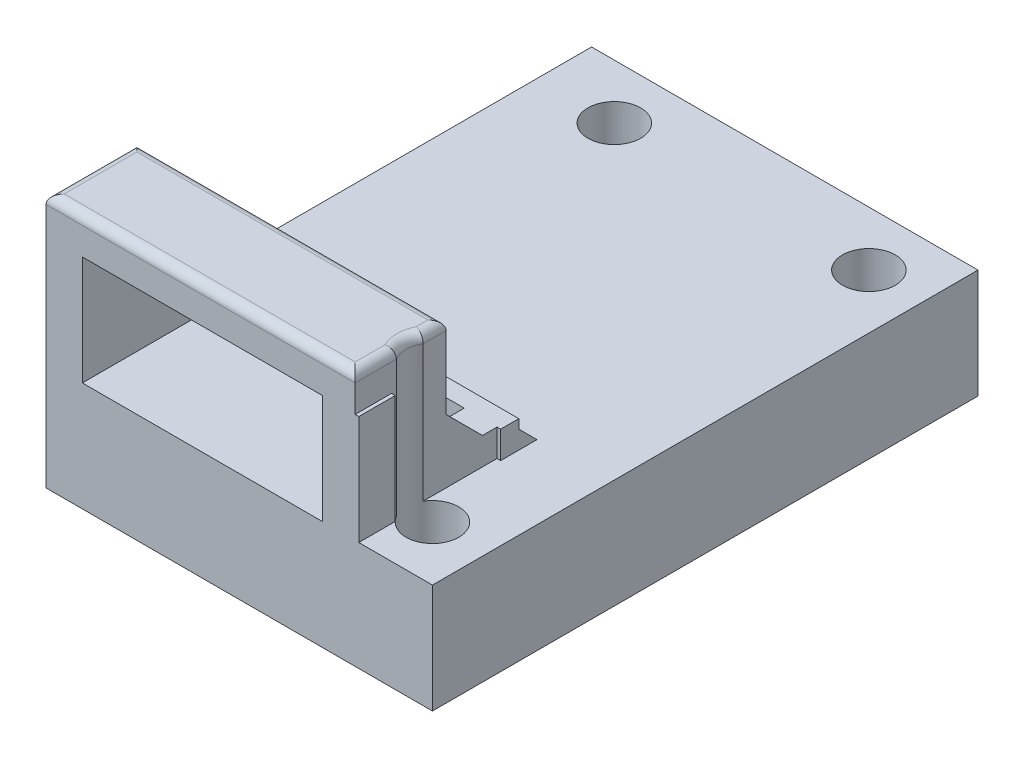
ISO-10303-21;
HEADER;
FILE_DESCRIPTION(('STEP AP214'),'2;1');
FILE_NAME('part.step','',(''),(''),'','','');
FILE_SCHEMA(('AUTOMOTIVE_DESIGN { 1 0 10303 214 1 1 1 1 }'));
ENDSEC;
DATA;
#1=APPLICATION_CONTEXT('core data for automotive mechanical design processes');
#2=APPLICATION_PROTOCOL_DEFINITION('international standard','automotive_design',2000,#1);
#3=PRODUCT_CONTEXT('',#1,'mechanical');
#4=PRODUCT('Part','Part','',(#3));
#5=PRODUCT_RELATED_PRODUCT_CATEGORY('part','',(#4));
#6=PRODUCT_DEFINITION_FORMATION('','',#4);
#7=PRODUCT_DEFINITION_CONTEXT('part definition',#1,'design');
#8=PRODUCT_DEFINITION('design','',#6,#7);
#9=PRODUCT_DEFINITION_SHAPE('','',#8);
#10=(LENGTH_UNIT() NAMED_UNIT(*) SI_UNIT(.MILLI.,.METRE.));
#11=(NAMED_UNIT(*) PLANE_ANGLE_UNIT() SI_UNIT($,.RADIAN.));
#12=(NAMED_UNIT(*) SI_UNIT($,.STERADIAN.) SOLID_ANGLE_UNIT());
#13=UNCERTAINTY_MEASURE_WITH_UNIT(LENGTH_MEASURE(1.E-05),#10,'distance_accuracy_value','');
#14=(GEOMETRIC_REPRESENTATION_CONTEXT(3) GLOBAL_UNCERTAINTY_ASSIGNED_CONTEXT((#13)) GLOBAL_UNIT_ASSIGNED_CONTEXT((#10,
#11,#12)) REPRESENTATION_CONTEXT('',''));
#15=CARTESIAN_POINT('',(0.,0.,0.));
#16=DIRECTION('',(0.,0.,1.));
#17=DIRECTION('',(1.,0.,0.));
#18=AXIS2_PLACEMENT_3D('',#15,#16,#17);
#19=CARTESIAN_POINT('',(-21.25,10.,-2.79999999999999));
#20=DIRECTION('',(0.,0.,-1.));
#21=DIRECTION('',(-1.,0.,0.));
#22=AXIS2_PLACEMENT_3D('',#19,#20,#21);
#23=PLANE('',#22);
#24=DIRECTION('',(0.,-1.,0.));
#25=VECTOR('',#24,1.);
#26=CARTESIAN_POINT('',(-6.05,5.5,-2.79999999999999));
#27=LINE('',#26,#25);
#28=CARTESIAN_POINT('',(-6.05,5.5,-2.79999999999999));
#29=VERTEX_POINT('',#28);
#30=CARTESIAN_POINT('',(-6.05,4.,-2.79999999999999));
#31=VERTEX_POINT('',#30);
#32=EDGE_CURVE('E298',#29,#31,#27,.T.);
#33=ORIENTED_EDGE('',*,*,#32,.F.);
#34=DIRECTION('',(1.,0.,0.));
#35=VECTOR('',#34,1.);
#36=CARTESIAN_POINT('',(-18.75,5.5,-2.79999999999999));
#37=LINE('',#36,#35);
#38=CARTESIAN_POINT('',(-19.25,5.5,-2.79999999999999));
#39=VERTEX_POINT('',#38);
#40=EDGE_CURVE('E316',#39,#29,#37,.T.);
#41=ORIENTED_EDGE('',*,*,#40,.F.);
#42=DIRECTION('',(0.,-1.,0.));
#43=VECTOR('',#42,1.);
#44=CARTESIAN_POINT('',(-19.25,5.5,-2.79999999999999));
#45=LINE('',#44,#43);
#46=CARTESIAN_POINT('',(-19.25,4.,-2.79999999999999));
#47=VERTEX_POINT('',#46);
#48=EDGE_CURVE('E313',#39,#47,#45,.T.);
#49=ORIENTED_EDGE('',*,*,#48,.T.);
#50=DIRECTION('',(1.,0.,0.));
#51=VECTOR('',#50,1.);
#52=CARTESIAN_POINT('',(-21.25,4.,-2.79999999999999));
#53=LINE('',#52,#51);
#54=EDGE_CURVE('E328',#47,#31,#53,.T.);
#55=ORIENTED_EDGE('',*,*,#54,.T.);
#56=EDGE_LOOP('',(#33,#41,#49,#55));
#57=FACE_BOUND('',#56,.T.);
#58=ADVANCED_FACE('F37',(#57),#23,.F.);
#59=DIRECTION('',(-1.,0.,0.));
#60=VECTOR('',#59,1.);
#61=CARTESIAN_POINT('',(-6.55,5.5,-2.79999999999999));
#62=LINE('',#61,#60);
#63=CARTESIAN_POINT('',(-4.05000000000001,5.5,-2.79999999999999));
#64=VERTEX_POINT('',#63);
#65=CARTESIAN_POINT('',(-4.24999999999999,5.5,-2.79999999999999));
#66=VERTEX_POINT('',#65);
#67=EDGE_CURVE('E261',#64,#66,#62,.T.);
#68=ORIENTED_EDGE('',*,*,#67,.T.);
#69=DIRECTION('',(0.,-1.,0.));
#70=VECTOR('',#69,1.);
#71=CARTESIAN_POINT('',(-4.24999999999999,5.5,-2.79999999999999));
#72=LINE('',#71,#70);
#73=CARTESIAN_POINT('',(-4.24999999999999,4.,-2.79999999999999));
#74=VERTEX_POINT('',#73);
#75=EDGE_CURVE('E303',#66,#74,#72,.T.);
#76=ORIENTED_EDGE('',*,*,#75,.T.);
#77=CARTESIAN_POINT('',(-4.05000000000001,4.,-2.79999999999999));
#78=VERTEX_POINT('',#77);
#79=EDGE_CURVE('E327',#74,#78,#53,.T.);
#80=ORIENTED_EDGE('',*,*,#79,.T.);
#81=DIRECTION('',(0.,-1.,0.));
#82=VECTOR('',#81,1.);
#83=CARTESIAN_POINT('',(-4.05000000000001,10.,-2.79999999999999));
#84=LINE('',#83,#82);
#85=EDGE_CURVE('E323',#64,#78,#84,.T.);
#86=ORIENTED_EDGE('',*,*,#85,.F.);
#87=EDGE_LOOP('',(#68,#76,#80,#86));
#88=FACE_BOUND('',#87,.T.);
#89=ADVANCED_FACE('F484',(#88),#23,.F.);
#90=CARTESIAN_POINT('',(-21.25,4.,0.));
#91=DIRECTION('',(1.,0.,0.));
#92=DIRECTION('',(0.,0.,-1.));
#93=AXIS2_PLACEMENT_3D('',#90,#91,#92);
#94=PLANE('',#93);
#95=DIRECTION('',(0.,-1.,0.));
#96=VECTOR('',#95,1.);
#97=CARTESIAN_POINT('',(-21.25,4.,5.00000000000001));
#98=LINE('',#97,#96);
#99=CARTESIAN_POINT('',(-21.25,11.5,5.00000000000001));
#100=VERTEX_POINT('',#99);
#101=CARTESIAN_POINT('',(-21.25,-2.,5.00000000000001));
#102=VERTEX_POINT('',#101);
#103=EDGE_CURVE('E386',#100,#102,#98,.T.);
#104=ORIENTED_EDGE('',*,*,#103,.F.);
#105=DIRECTION('',(0.,0.,1.));
#106=VECTOR('',#105,1.);
#107=CARTESIAN_POINT('',(-21.25,11.5,0.));
#108=LINE('',#107,#106);
#109=CARTESIAN_POINT('',(-21.25,11.5,0.));
#110=VERTEX_POINT('',#109);
#111=EDGE_CURVE('E434',#100,#110,#108,.F.);
#112=ORIENTED_EDGE('',*,*,#111,.T.);
#113=DIRECTION('',(0.,-1.,0.));
#114=VECTOR('',#113,1.);
#115=CARTESIAN_POINT('',(-21.25,12.,0.));
#116=LINE('',#115,#114);
#117=CARTESIAN_POINT('',(-21.25,7.50000000000002,0.));
#118=VERTEX_POINT('',#117);
#119=EDGE_CURVE('E281',#110,#118,#116,.T.);
#120=ORIENTED_EDGE('',*,*,#119,.T.);
#121=DIRECTION('',(0.,-0.707106781186551,-0.707106781186544));
#122=VECTOR('',#121,1.);
#123=CARTESIAN_POINT('',(-21.25,5.74999999999999,-1.75));
#124=LINE('',#123,#122);
#125=CARTESIAN_POINT('',(-21.25,5.5,-2.));
#126=VERTEX_POINT('',#125);
#127=EDGE_CURVE('E409',#118,#126,#124,.T.);
#128=ORIENTED_EDGE('',*,*,#127,.T.);
#129=DIRECTION('',(0.,0.,1.));
#130=VECTOR('',#129,1.);
#131=CARTESIAN_POINT('',(-21.25,5.5,3.00000000000001));
#132=LINE('',#131,#130);
#133=CARTESIAN_POINT('',(-21.25,5.5,-3.79999999999999));
#134=VERTEX_POINT('',#133);
#135=EDGE_CURVE('E310',#134,#126,#132,.T.);
#136=ORIENTED_EDGE('',*,*,#135,.F.);
#137=DIRECTION('',(0.,-1.,0.));
#138=VECTOR('',#137,1.);
#139=CARTESIAN_POINT('',(-21.25,10.,-3.79999999999999));
#140=LINE('',#139,#138);
#141=CARTESIAN_POINT('',(-21.25,5.00000000000001,-3.79999999999999));
#142=VERTEX_POINT('',#141);
#143=EDGE_CURVE('E331',#134,#142,#140,.T.);
#144=ORIENTED_EDGE('',*,*,#143,.T.);
#145=DIRECTION('',(0.,-0.707106781186551,-0.707106781186544));
#146=VECTOR('',#145,1.);
#147=CARTESIAN_POINT('',(-21.25,6.4,-2.40000000000002));
#148=LINE('',#147,#146);
#149=CARTESIAN_POINT('',(-21.25,4.,-4.79999999999999));
#150=VERTEX_POINT('',#149);
#151=EDGE_CURVE('E394',#142,#150,#148,.T.);
#152=ORIENTED_EDGE('',*,*,#151,.T.);
#153=DIRECTION('',(0.,0.,1.));
#154=VECTOR('',#153,1.);
#155=CARTESIAN_POINT('',(-21.25,4.,0.));
#156=LINE('',#155,#154);
#157=CARTESIAN_POINT('',(-21.25,4.,-25.));
#158=VERTEX_POINT('',#157);
#159=EDGE_CURVE('E379',#158,#150,#156,.T.);
#160=ORIENTED_EDGE('',*,*,#159,.F.);
#161=DIRECTION('',(0.,1.,0.));
#162=VECTOR('',#161,1.);
#163=CARTESIAN_POINT('',(-21.25,4.,-25.));
#164=LINE('',#163,#162);
#165=CARTESIAN_POINT('',(-21.25,-2.,-25.));
#166=VERTEX_POINT('',#165);
#167=EDGE_CURVE('E234',#166,#158,#164,.T.);
#168=ORIENTED_EDGE('',*,*,#167,.F.);
#169=DIRECTION('',(0.,0.,-1.));
#170=VECTOR('',#169,1.);
#171=CARTESIAN_POINT('',(-21.25,-2.,5.00000000000001));
#172=LINE('',#171,#170);
#173=EDGE_CURVE('E251',#102,#166,#172,.T.);
#174=ORIENTED_EDGE('',*,*,#173,.F.);
#175=EDGE_LOOP('',(#104,#112,#120,#128,#136,#144,#152,#160,#168,#174));
#176=FACE_BOUND('',#175,.T.);
#177=ADVANCED_FACE('F490',(#176),#94,.F.);
#178=CARTESIAN_POINT('',(-21.25,10.,-3.79999999999999));
#179=DIRECTION('',(0.,0.,1.));
#180=DIRECTION('',(1.,0.,0.));
#181=AXIS2_PLACEMENT_3D('',#178,#179,#180);
#182=PLANE('',#181);
#183=DIRECTION('',(-1.,0.,0.));
#184=VECTOR('',#183,1.);
#185=CARTESIAN_POINT('',(-18.75,5.5,-3.79999999999999));
#186=LINE('',#185,#184);
#187=CARTESIAN_POINT('',(-4.05,5.5,-3.79999999999999));
#188=VERTEX_POINT('',#187);
#189=EDGE_CURVE('E318',#188,#134,#186,.T.);
#190=ORIENTED_EDGE('',*,*,#189,.F.);
#191=DIRECTION('',(0.,-1.,0.));
#192=VECTOR('',#191,1.);
#193=CARTESIAN_POINT('',(-4.05,10.,-3.79999999999999));
#194=LINE('',#193,#192);
#195=CARTESIAN_POINT('',(-4.05,5.00000000000001,-3.79999999999999));
#196=VERTEX_POINT('',#195);
#197=EDGE_CURVE('E325',#188,#196,#194,.T.);
#198=ORIENTED_EDGE('',*,*,#197,.T.);
#199=DIRECTION('',(-1.,0.,0.));
#200=VECTOR('',#199,1.);
#201=CARTESIAN_POINT('',(-21.25,5.00000000000001,-3.79999999999999));
#202=LINE('',#201,#200);
#203=EDGE_CURVE('E388',#196,#142,#202,.T.);
#204=ORIENTED_EDGE('',*,*,#203,.T.);
#205=ORIENTED_EDGE('',*,*,#143,.F.);
#206=EDGE_LOOP('',(#190,#198,#204,#205));
#207=FACE_BOUND('',#206,.T.);
#208=ADVANCED_FACE('F495',(#207),#182,.F.);
#209=CARTESIAN_POINT('',(-4.05,10.,-3.79999999999999));
#210=DIRECTION('',(-1.,0.,0.));
#211=DIRECTION('',(0.,0.,1.));
#212=AXIS2_PLACEMENT_3D('',#209,#210,#211);
#213=PLANE('',#212);
#214=DIRECTION('',(0.,0.,1.));
#215=VECTOR('',#214,1.);
#216=CARTESIAN_POINT('',(-4.05000000000001,5.5,-2.79999999999999));
#217=LINE('',#216,#215);
#218=EDGE_CURVE('E264',#188,#64,#217,.T.);
#219=ORIENTED_EDGE('',*,*,#218,.T.);
#220=ORIENTED_EDGE('',*,*,#85,.T.);
#221=DIRECTION('',(0.,0.,-1.));
#222=VECTOR('',#221,1.);
#223=CARTESIAN_POINT('',(-4.05,4.,-3.79999999999999));
#224=LINE('',#223,#222);
#225=CARTESIAN_POINT('',(-4.05,4.,-4.79999999999999));
#226=VERTEX_POINT('',#225);
#227=EDGE_CURVE('E321',#78,#226,#224,.T.);
#228=ORIENTED_EDGE('',*,*,#227,.T.);
#229=DIRECTION('',(0.,0.707106781186551,0.707106781186544));
#230=VECTOR('',#229,1.);
#231=CARTESIAN_POINT('',(-4.05000000000001,7.50000000000003,-1.29999999999999));
#232=LINE('',#231,#230);
#233=EDGE_CURVE('E396',#226,#196,#232,.T.);
#234=ORIENTED_EDGE('',*,*,#233,.T.);
#235=ORIENTED_EDGE('',*,*,#197,.F.);
#236=EDGE_LOOP('',(#219,#220,#228,#234,#235));
#237=FACE_BOUND('',#236,.T.);
#238=ADVANCED_FACE('F655',(#237),#213,.F.);
#239=CARTESIAN_POINT('',(-4.24999999999999,5.5,3.00000000000001));
#240=DIRECTION('',(-1.,0.,0.));
#241=DIRECTION('',(0.,0.,1.));
#242=AXIS2_PLACEMENT_3D('',#239,#240,#241);
#243=PLANE('',#242);
#244=DIRECTION('',(0.,1.,0.));
#245=VECTOR('',#244,1.);
#246=CARTESIAN_POINT('',(-4.24999999999999,-4.5,2.73484692283497));
#247=LINE('',#246,#245);
#248=CARTESIAN_POINT('',(-4.24999999999999,4.,2.73484692283497));
#249=VERTEX_POINT('',#248);
#250=CARTESIAN_POINT('',(-4.24999999999999,11.5,2.73484692283497));
#251=VERTEX_POINT('',#250);
#252=EDGE_CURVE('E289',#249,#251,#247,.T.);
#253=ORIENTED_EDGE('',*,*,#252,.T.);
#254=DIRECTION('',(0.,0.,-1.));
#255=VECTOR('',#254,1.);
#256=CARTESIAN_POINT('',(-4.24999999999999,11.5,3.00000000000001));
#257=LINE('',#256,#255);
#258=CARTESIAN_POINT('',(-4.24999999999999,11.5,5.00000000000001));
#259=VERTEX_POINT('',#258);
#260=EDGE_CURVE('E12',#251,#259,#257,.F.);
#261=ORIENTED_EDGE('',*,*,#260,.T.);
#262=DIRECTION('',(0.,-1.,0.));
#263=VECTOR('',#262,1.);
#264=CARTESIAN_POINT('',(-4.24999999999999,12.,5.00000000000001));
#265=LINE('',#264,#263);
#266=CARTESIAN_POINT('',(-4.24999999999999,10.,5.00000000000001));
#267=VERTEX_POINT('',#266);
#268=EDGE_CURVE('E285',#259,#267,#265,.T.);
#269=ORIENTED_EDGE('',*,*,#268,.T.);
#270=DIRECTION('',(0.,0.,-1.));
#271=VECTOR('',#270,1.);
#272=CARTESIAN_POINT('',(-4.24999999999999,10.,5.00000000000001));
#273=LINE('',#272,#271);
#274=CARTESIAN_POINT('',(-4.24999999999999,10.,3.00000000000001));
#275=VERTEX_POINT('',#274);
#276=EDGE_CURVE('E276',#267,#275,#273,.T.);
#277=ORIENTED_EDGE('',*,*,#276,.T.);
#278=DIRECTION('',(0.,-1.,0.));
#279=VECTOR('',#278,1.);
#280=CARTESIAN_POINT('',(-4.24999999999999,5.5,3.00000000000001));
#281=LINE('',#280,#279);
#282=CARTESIAN_POINT('',(-4.24999999999999,4.,3.00000000000001));
#283=VERTEX_POINT('',#282);
#284=EDGE_CURVE('E305',#275,#283,#281,.T.);
#285=ORIENTED_EDGE('',*,*,#284,.T.);
#286=DIRECTION('',(0.,0.,-1.));
#287=VECTOR('',#286,1.);
#288=CARTESIAN_POINT('',(-4.24999999999999,4.,3.00000000000001));
#289=LINE('',#288,#287);
#290=EDGE_CURVE('E296',#283,#249,#289,.T.);
#291=ORIENTED_EDGE('',*,*,#290,.T.);
#292=EDGE_LOOP('',(#253,#261,#269,#277,#285,#291));
#293=FACE_BOUND('',#292,.T.);
#294=ADVANCED_FACE('F600',(#293),#243,.F.);
#295=CARTESIAN_POINT('',(0.,10.,0.));
#296=DIRECTION('',(0.,-1.,0.));
#297=DIRECTION('',(0.,0.,-1.));
#298=AXIS2_PLACEMENT_3D('',#295,#296,#297);
#299=PLANE('',#298);
#300=DIRECTION('',(-1.,0.,0.));
#301=VECTOR('',#300,1.);
#302=CARTESIAN_POINT('',(-21.25,10.,0.));
#303=LINE('',#302,#301);
#304=CARTESIAN_POINT('',(-6.05,10.,0.));
#305=VERTEX_POINT('',#304);
#306=CARTESIAN_POINT('',(-19.25,10.,0.));
#307=VERTEX_POINT('',#306);
#308=EDGE_CURVE('E279',#305,#307,#303,.T.);
#309=ORIENTED_EDGE('',*,*,#308,.F.);
#310=DIRECTION('',(0.,0.,1.));
#311=VECTOR('',#310,1.);
#312=CARTESIAN_POINT('',(-6.05,10.,3.00000000000001));
#313=LINE('',#312,#311);
#314=CARTESIAN_POINT('',(-6.05,10.,5.00000000000001));
#315=VERTEX_POINT('',#314);
#316=EDGE_CURVE('E334',#305,#315,#313,.T.);
#317=ORIENTED_EDGE('',*,*,#316,.T.);
#318=DIRECTION('',(1.,0.,0.));
#319=VECTOR('',#318,1.);
#320=CARTESIAN_POINT('',(-21.25,10.,5.00000000000001));
#321=LINE('',#320,#319);
#322=CARTESIAN_POINT('',(-19.25,10.,5.00000000000001));
#323=VERTEX_POINT('',#322);
#324=EDGE_CURVE('E273',#323,#315,#321,.T.);
#325=ORIENTED_EDGE('',*,*,#324,.F.);
#326=DIRECTION('',(0.,0.,-1.));
#327=VECTOR('',#326,1.);
#328=CARTESIAN_POINT('',(-19.25,10.,5.00000000000001));
#329=LINE('',#328,#327);
#330=EDGE_CURVE('E358',#323,#307,#329,.T.);
#331=ORIENTED_EDGE('',*,*,#330,.T.);
#332=EDGE_LOOP('',(#309,#317,#325,#331));
#333=FACE_BOUND('',#332,.T.);
#334=ADVANCED_FACE('F505',(#333),#299,.T.);
#335=CARTESIAN_POINT('',(-6.05,10.,3.00000000000001));
#336=DIRECTION('',(0.,0.,1.));
#337=DIRECTION('',(1.,0.,0.));
#338=AXIS2_PLACEMENT_3D('',#335,#336,#337);
#339=PLANE('',#338);
#340=ORIENTED_EDGE('',*,*,#284,.F.);
#341=DIRECTION('',(-1.,0.,0.));
#342=VECTOR('',#341,1.);
#343=CARTESIAN_POINT('',(-6.05,10.,3.00000000000001));
#344=LINE('',#343,#342);
#345=CARTESIAN_POINT('',(-4.05,10.,3.00000000000001));
#346=VERTEX_POINT('',#345);
#347=EDGE_CURVE('E341',#346,#275,#344,.T.);
#348=ORIENTED_EDGE('',*,*,#347,.F.);
#349=DIRECTION('',(0.,-1.,0.));
#350=VECTOR('',#349,1.);
#351=CARTESIAN_POINT('',(-4.05,10.,3.00000000000001));
#352=LINE('',#351,#350);
#353=CARTESIAN_POINT('',(-4.05,4.,3.00000000000001));
#354=VERTEX_POINT('',#353);
#355=EDGE_CURVE('E344',#346,#354,#352,.T.);
#356=ORIENTED_EDGE('',*,*,#355,.T.);
#357=DIRECTION('',(-1.,0.,0.));
#358=VECTOR('',#357,1.);
#359=CARTESIAN_POINT('',(-6.05,4.,3.00000000000001));
#360=LINE('',#359,#358);
#361=EDGE_CURVE('E337',#354,#283,#360,.T.);
#362=ORIENTED_EDGE('',*,*,#361,.T.);
#363=EDGE_LOOP('',(#340,#348,#356,#362));
#364=FACE_BOUND('',#363,.T.);
#365=ADVANCED_FACE('F501',(#364),#339,.F.);
#366=CARTESIAN_POINT('',(0.,10.,0.));
#367=DIRECTION('',(0.,1.,0.));
#368=DIRECTION('',(0.,0.,1.));
#369=AXIS2_PLACEMENT_3D('',#366,#367,#368);
#370=PLANE('',#369);
#371=ORIENTED_EDGE('',*,*,#347,.T.);
#372=ORIENTED_EDGE('',*,*,#276,.F.);
#373=DIRECTION('',(1.,0.,0.));
#374=VECTOR('',#373,1.);
#375=CARTESIAN_POINT('',(-6.05,10.,5.00000000000001));
#376=LINE('',#375,#374);
#377=CARTESIAN_POINT('',(-4.05000000000001,10.,5.00000000000001));
#378=VERTEX_POINT('',#377);
#379=EDGE_CURVE('E336',#267,#378,#376,.T.);
#380=ORIENTED_EDGE('',*,*,#379,.T.);
#381=DIRECTION('',(0.,0.,-1.));
#382=VECTOR('',#381,1.);
#383=CARTESIAN_POINT('',(-4.05,10.,3.00000000000001));
#384=LINE('',#383,#382);
#385=EDGE_CURVE('E339',#378,#346,#384,.T.);
#386=ORIENTED_EDGE('',*,*,#385,.T.);
#387=EDGE_LOOP('',(#371,#372,#380,#386));
#388=FACE_BOUND('',#387,.T.);
#389=ADVANCED_FACE('F497',(#388),#370,.T.);
#390=CARTESIAN_POINT('',(0.,4.,0.));
#391=DIRECTION('',(0.,1.,0.));
#392=DIRECTION('',(0.,0.,1.));
#393=AXIS2_PLACEMENT_3D('',#390,#391,#392);
#394=PLANE('',#393);
#395=DIRECTION('',(0.,0.,1.));
#396=VECTOR('',#395,1.);
#397=CARTESIAN_POINT('',(-6.05,4.,3.00000000000001));
#398=LINE('',#397,#396);
#399=CARTESIAN_POINT('',(-6.05,4.,5.00000000000001));
#400=VERTEX_POINT('',#399);
#401=EDGE_CURVE('E333',#31,#400,#398,.T.);
#402=ORIENTED_EDGE('',*,*,#401,.F.);
#403=ORIENTED_EDGE('',*,*,#54,.F.);
#404=DIRECTION('',(0.,0.,-1.));
#405=VECTOR('',#404,1.);
#406=CARTESIAN_POINT('',(-19.25,4.,5.00000000000001));
#407=LINE('',#406,#405);
#408=CARTESIAN_POINT('',(-19.25,4.,5.00000000000001));
#409=VERTEX_POINT('',#408);
#410=EDGE_CURVE('E357',#409,#47,#407,.T.);
#411=ORIENTED_EDGE('',*,*,#410,.F.);
#412=DIRECTION('',(1.,0.,0.));
#413=VECTOR('',#412,1.);
#414=CARTESIAN_POINT('',(-21.25,4.,5.00000000000001));
#415=LINE('',#414,#413);
#416=EDGE_CURVE('E383',#409,#400,#415,.T.);
#417=ORIENTED_EDGE('',*,*,#416,.T.);
#418=EDGE_LOOP('',(#402,#403,#411,#417));
#419=FACE_BOUND('',#418,.T.);
#420=ADVANCED_FACE('F500',(#419),#394,.T.);
#421=CARTESIAN_POINT('',(-17.,4.,-22.));
#422=DIRECTION('',(0.,1.,0.));
#423=DIRECTION('',(0.,0.,1.));
#424=AXIS2_PLACEMENT_3D('',#421,#422,#423);
#425=CIRCLE('',#424,1.45);
#426=CARTESIAN_POINT('',(-17.,4.,-20.55));
#427=VERTEX_POINT('',#426);
#428=EDGE_CURVE('E235',#427,#427,#425,.T.);
#429=ORIENTED_EDGE('',*,*,#428,.F.);
#430=EDGE_LOOP('',(#429));
#431=FACE_BOUND('',#430,.T.);
#432=CARTESIAN_POINT('',(-3.,4.,-22.));
#433=DIRECTION('',(0.,1.,0.));
#434=DIRECTION('',(0.,0.,1.));
#435=AXIS2_PLACEMENT_3D('',#432,#433,#434);
#436=CIRCLE('',#435,1.45);
#437=CARTESIAN_POINT('',(-3.,4.,-20.55));
#438=VERTEX_POINT('',#437);
#439=EDGE_CURVE('E370',#438,#438,#436,.T.);
#440=ORIENTED_EDGE('',*,*,#439,.F.);
#441=EDGE_LOOP('',(#440));
#442=FACE_BOUND('',#441,.T.);
#443=ORIENTED_EDGE('',*,*,#159,.T.);
#444=DIRECTION('',(1.,0.,0.));
#445=VECTOR('',#444,1.);
#446=CARTESIAN_POINT('',(0.,4.,-4.79999999999999));
#447=LINE('',#446,#445);
#448=EDGE_CURVE('E391',#150,#226,#447,.T.);
#449=ORIENTED_EDGE('',*,*,#448,.T.);
#450=ORIENTED_EDGE('',*,*,#227,.F.);
#451=ORIENTED_EDGE('',*,*,#79,.F.);
#452=CARTESIAN_POINT('',(-4.24999999999999,4.,1.26515307716504));
#453=VERTEX_POINT('',#452);
#454=EDGE_CURVE('E291',#453,#74,#289,.T.);
#455=ORIENTED_EDGE('',*,*,#454,.F.);
#456=CARTESIAN_POINT('',(-3.,4.,2.00000000000001));
#457=DIRECTION('',(0.,1.,0.));
#458=DIRECTION('',(0.,0.,1.));
#459=AXIS2_PLACEMENT_3D('',#456,#457,#458);
#460=CIRCLE('',#459,1.45);
#461=EDGE_CURVE('E366',#354,#453,#460,.T.);
#462=ORIENTED_EDGE('',*,*,#461,.F.);
#463=DIRECTION('',(0.,0.,-1.));
#464=VECTOR('',#463,1.);
#465=CARTESIAN_POINT('',(-4.05,4.,3.00000000000001));
#466=LINE('',#465,#464);
#467=CARTESIAN_POINT('',(-4.05000000000001,4.,5.00000000000001));
#468=VERTEX_POINT('',#467);
#469=EDGE_CURVE('E347',#468,#354,#466,.T.);
#470=ORIENTED_EDGE('',*,*,#469,.F.);
#471=CARTESIAN_POINT('',(0.,4.,5.00000000000001));
#472=VERTEX_POINT('',#471);
#473=EDGE_CURVE('E382',#468,#472,#415,.T.);
#474=ORIENTED_EDGE('',*,*,#473,.T.);
#475=DIRECTION('',(0.,0.,-1.));
#476=VECTOR('',#475,1.);
#477=CARTESIAN_POINT('',(0.,4.,0.));
#478=LINE('',#477,#476);
#479=CARTESIAN_POINT('',(0.,4.,-25.));
#480=VERTEX_POINT('',#479);
#481=EDGE_CURVE('E377',#472,#480,#478,.T.);
#482=ORIENTED_EDGE('',*,*,#481,.T.);
#483=DIRECTION('',(1.,0.,0.));
#484=VECTOR('',#483,1.);
#485=CARTESIAN_POINT('',(0.,4.,-25.));
#486=LINE('',#485,#484);
#487=EDGE_CURVE('E231',#158,#480,#486,.T.);
#488=ORIENTED_EDGE('',*,*,#487,.F.);
#489=EDGE_LOOP('',(#443,#449,#450,#451,#455,#462,#470,#474,#482,#488));
#490=FACE_BOUND('',#489,.T.);
#491=ADVANCED_FACE('F536',(#431,#442,#490),#394,.T.);
#492=EDGE_CURVE('E365',#249,#354,#460,.T.);
#493=ORIENTED_EDGE('',*,*,#492,.F.);
#494=ORIENTED_EDGE('',*,*,#290,.F.);
#495=ORIENTED_EDGE('',*,*,#361,.F.);
#496=EDGE_LOOP('',(#493,#494,#495));
#497=FACE_BOUND('',#496,.T.);
#498=ADVANCED_FACE('F538',(#497),#394,.T.);
#499=CARTESIAN_POINT('',(0.,4.,0.));
#500=DIRECTION('',(-1.,0.,0.));
#501=DIRECTION('',(0.,0.,1.));
#502=AXIS2_PLACEMENT_3D('',#499,#500,#501);
#503=PLANE('',#502);
#504=DIRECTION('',(0.,-1.,0.));
#505=VECTOR('',#504,1.);
#506=CARTESIAN_POINT('',(0.,4.,5.00000000000001));
#507=LINE('',#506,#505);
#508=CARTESIAN_POINT('',(0.,-2.,5.00000000000001));
#509=VERTEX_POINT('',#508);
#510=EDGE_CURVE('E241',#472,#509,#507,.T.);
#511=ORIENTED_EDGE('',*,*,#510,.T.);
#512=DIRECTION('',(0.,0.,1.));
#513=VECTOR('',#512,1.);
#514=CARTESIAN_POINT('',(0.,-2.,-25.));
#515=LINE('',#514,#513);
#516=CARTESIAN_POINT('',(0.,-2.,-25.));
#517=VERTEX_POINT('',#516);
#518=EDGE_CURVE('E238',#517,#509,#515,.T.);
#519=ORIENTED_EDGE('',*,*,#518,.F.);
#520=DIRECTION('',(0.,-1.,0.));
#521=VECTOR('',#520,1.);
#522=CARTESIAN_POINT('',(0.,4.,-25.));
#523=LINE('',#522,#521);
#524=EDGE_CURVE('E224',#480,#517,#523,.T.);
#525=ORIENTED_EDGE('',*,*,#524,.F.);
#526=ORIENTED_EDGE('',*,*,#481,.F.);
#527=EDGE_LOOP('',(#511,#519,#525,#526));
#528=FACE_BOUND('',#527,.T.);
#529=ADVANCED_FACE('F239',(#528),#503,.F.);
#530=CARTESIAN_POINT('',(-21.25,4.,5.00000000000001));
#531=DIRECTION('',(0.,0.,-1.));
#532=DIRECTION('',(-1.,0.,0.));
#533=AXIS2_PLACEMENT_3D('',#530,#531,#532);
#534=PLANE('',#533);
#535=DIRECTION('',(0.,-1.,0.));
#536=VECTOR('',#535,1.);
#537=CARTESIAN_POINT('',(-19.25,10.,5.00000000000001));
#538=LINE('',#537,#536);
#539=EDGE_CURVE('E361',#323,#409,#538,.T.);
#540=ORIENTED_EDGE('',*,*,#539,.F.);
#541=ORIENTED_EDGE('',*,*,#324,.T.);
#542=DIRECTION('',(0.,-1.,0.));
#543=VECTOR('',#542,1.);
#544=CARTESIAN_POINT('',(-6.05,10.,5.00000000000001));
#545=LINE('',#544,#543);
#546=EDGE_CURVE('E355',#315,#400,#545,.T.);
#547=ORIENTED_EDGE('',*,*,#546,.T.);
#548=ORIENTED_EDGE('',*,*,#416,.F.);
#549=EDGE_LOOP('',(#540,#541,#547,#548));
#550=FACE_BOUND('',#549,.T.);
#551=ORIENTED_EDGE('',*,*,#268,.F.);
#552=DIRECTION('',(1.,0.,0.));
#553=VECTOR('',#552,1.);
#554=CARTESIAN_POINT('',(-21.25,11.5,5.00000000000001));
#555=LINE('',#554,#553);
#556=EDGE_CURVE('E431',#259,#100,#555,.F.);
#557=ORIENTED_EDGE('',*,*,#556,.T.);
#558=ORIENTED_EDGE('',*,*,#103,.T.);
#559=DIRECTION('',(-1.,0.,0.));
#560=VECTOR('',#559,1.);
#561=CARTESIAN_POINT('',(0.,-2.,5.00000000000001));
#562=LINE('',#561,#560);
#563=EDGE_CURVE('E245',#509,#102,#562,.T.);
#564=ORIENTED_EDGE('',*,*,#563,.F.);
#565=ORIENTED_EDGE('',*,*,#510,.F.);
#566=ORIENTED_EDGE('',*,*,#473,.F.);
#567=DIRECTION('',(0.,-1.,0.));
#568=VECTOR('',#567,1.);
#569=CARTESIAN_POINT('',(-4.05000000000001,10.,5.00000000000001));
#570=LINE('',#569,#568);
#571=EDGE_CURVE('E353',#378,#468,#570,.T.);
#572=ORIENTED_EDGE('',*,*,#571,.F.);
#573=ORIENTED_EDGE('',*,*,#379,.F.);
#574=EDGE_LOOP('',(#551,#557,#558,#564,#565,#566,#572,#573));
#575=FACE_BOUND('',#574,.T.);
#576=ADVANCED_FACE('F533',(#550,#575),#534,.F.);
#577=CARTESIAN_POINT('',(0.,0.,-25.));
#578=DIRECTION('',(0.,0.,-1.));
#579=DIRECTION('',(-1.,0.,0.));
#580=AXIS2_PLACEMENT_3D('',#577,#578,#579);
#581=PLANE('',#580);
#582=ORIENTED_EDGE('',*,*,#524,.T.);
#583=DIRECTION('',(1.,0.,0.));
#584=VECTOR('',#583,1.);
#585=CARTESIAN_POINT('',(-21.25,-2.,-25.));
#586=LINE('',#585,#584);
#587=EDGE_CURVE('E229',#166,#517,#586,.T.);
#588=ORIENTED_EDGE('',*,*,#587,.F.);
#589=ORIENTED_EDGE('',*,*,#167,.T.);
#590=ORIENTED_EDGE('',*,*,#487,.T.);
#591=EDGE_LOOP('',(#582,#588,#589,#590));
#592=FACE_BOUND('',#591,.T.);
#593=ADVANCED_FACE('F226',(#592),#581,.T.);
#594=CARTESIAN_POINT('',(-3.,-1.,-22.));
#595=DIRECTION('',(0.,1.,0.));
#596=DIRECTION('',(0.,0.,1.));
#597=AXIS2_PLACEMENT_3D('',#594,#595,#596);
#598=CYLINDRICAL_SURFACE('',#597,1.45);
#599=ORIENTED_EDGE('',*,*,#439,.T.);
#600=EDGE_LOOP('',(#599));
#601=FACE_BOUND('',#600,.T.);
#602=CARTESIAN_POINT('',(-3.,-2.,-22.));
#603=DIRECTION('',(0.,-1.,0.));
#604=DIRECTION('',(0.,0.,-1.));
#605=AXIS2_PLACEMENT_3D('',#602,#603,#604);
#606=CIRCLE('',#605,1.45);
#607=CARTESIAN_POINT('',(-3.,-2.,-23.45));
#608=VERTEX_POINT('',#607);
#609=EDGE_CURVE('E255',#608,#608,#606,.T.);
#610=ORIENTED_EDGE('',*,*,#609,.T.);
#611=EDGE_LOOP('',(#610));
#612=FACE_BOUND('',#611,.T.);
#613=ADVANCED_FACE('F526',(#601,#612),#598,.F.);
#614=CARTESIAN_POINT('',(-17.,-1.,-22.));
#615=DIRECTION('',(0.,1.,0.));
#616=DIRECTION('',(0.,0.,1.));
#617=AXIS2_PLACEMENT_3D('',#614,#615,#616);
#618=CYLINDRICAL_SURFACE('',#617,1.45);
#619=ORIENTED_EDGE('',*,*,#428,.T.);
#620=EDGE_LOOP('',(#619));
#621=FACE_BOUND('',#620,.T.);
#622=CARTESIAN_POINT('',(-17.,-2.,-22.));
#623=DIRECTION('',(0.,-1.,0.));
#624=DIRECTION('',(0.,0.,-1.));
#625=AXIS2_PLACEMENT_3D('',#622,#623,#624);
#626=CIRCLE('',#625,1.45);
#627=CARTESIAN_POINT('',(-17.,-2.,-23.45));
#628=VERTEX_POINT('',#627);
#629=EDGE_CURVE('E252',#628,#628,#626,.T.);
#630=ORIENTED_EDGE('',*,*,#629,.T.);
#631=EDGE_LOOP('',(#630));
#632=FACE_BOUND('',#631,.T.);
#633=ADVANCED_FACE('F523',(#621,#632),#618,.F.);
#634=CARTESIAN_POINT('',(-3.,-1.,2.00000000000001));
#635=DIRECTION('',(0.,1.,0.));
#636=DIRECTION('',(0.,0.,1.));
#637=AXIS2_PLACEMENT_3D('',#634,#635,#636);
#638=CYLINDRICAL_SURFACE('',#637,1.45);
#639=DIRECTION('',(0.,1.,0.));
#640=VECTOR('',#639,1.);
#641=CARTESIAN_POINT('',(-4.24999999999999,-4.5,1.26515307716504));
#642=LINE('',#641,#640);
#643=CARTESIAN_POINT('',(-4.24999999999999,11.5,1.26515307716504));
#644=VERTEX_POINT('',#643);
#645=EDGE_CURVE('E287',#644,#453,#642,.F.);
#646=ORIENTED_EDGE('',*,*,#645,.F.);
#647=CARTESIAN_POINT('',(-3.,11.5,2.00000000000001));
#648=DIRECTION('',(0.,-1.,0.));
#649=DIRECTION('',(0.,0.,-1.));
#650=AXIS2_PLACEMENT_3D('',#647,#648,#649);
#651=CIRCLE('',#650,1.45);
#652=EDGE_CURVE('E46',#644,#251,#651,.F.);
#653=ORIENTED_EDGE('',*,*,#652,.T.);
#654=ORIENTED_EDGE('',*,*,#252,.F.);
#655=ORIENTED_EDGE('',*,*,#492,.T.);
#656=ORIENTED_EDGE('',*,*,#461,.T.);
#657=EDGE_LOOP('',(#646,#653,#654,#655,#656));
#658=FACE_BOUND('',#657,.T.);
#659=CARTESIAN_POINT('',(-3.,-2.,2.00000000000001));
#660=DIRECTION('',(0.,-1.,0.));
#661=DIRECTION('',(0.,0.,-1.));
#662=AXIS2_PLACEMENT_3D('',#659,#660,#661);
#663=CIRCLE('',#662,1.45);
#664=CARTESIAN_POINT('',(-3.,-2.,0.550000000000009));
#665=VERTEX_POINT('',#664);
#666=EDGE_CURVE('E615',#665,#665,#663,.T.);
#667=ORIENTED_EDGE('',*,*,#666,.T.);
#668=EDGE_LOOP('',(#667));
#669=FACE_BOUND('',#668,.T.);
#670=ADVANCED_FACE('F519',(#658,#669),#638,.F.);
#671=CARTESIAN_POINT('',(-19.25,10.,5.00000000000001));
#672=DIRECTION('',(-1.,0.,0.));
#673=DIRECTION('',(0.,0.,1.));
#674=AXIS2_PLACEMENT_3D('',#671,#672,#673);
#675=PLANE('',#674);
#676=ORIENTED_EDGE('',*,*,#410,.T.);
#677=ORIENTED_EDGE('',*,*,#48,.F.);
#678=DIRECTION('',(0.,0.,-1.));
#679=VECTOR('',#678,1.);
#680=CARTESIAN_POINT('',(-19.25,5.5,3.00000000000001));
#681=LINE('',#680,#679);
#682=CARTESIAN_POINT('',(-19.25,5.5,-2.));
#683=VERTEX_POINT('',#682);
#684=EDGE_CURVE('E308',#683,#39,#681,.T.);
#685=ORIENTED_EDGE('',*,*,#684,.F.);
#686=DIRECTION('',(0.,0.707106781186551,0.707106781186544));
#687=VECTOR('',#686,1.);
#688=CARTESIAN_POINT('',(-19.25,11.25,3.74999999999998));
#689=LINE('',#688,#687);
#690=CARTESIAN_POINT('',(-19.25,7.50000000000002,0.));
#691=VERTEX_POINT('',#690);
#692=EDGE_CURVE('E411',#683,#691,#689,.T.);
#693=ORIENTED_EDGE('',*,*,#692,.T.);
#694=DIRECTION('',(0.,-1.,0.));
#695=VECTOR('',#694,1.);
#696=CARTESIAN_POINT('',(-19.25,12.002,0.));
#697=LINE('',#696,#695);
#698=EDGE_CURVE('E270',#307,#691,#697,.T.);
#699=ORIENTED_EDGE('',*,*,#698,.F.);
#700=ORIENTED_EDGE('',*,*,#330,.F.);
#701=ORIENTED_EDGE('',*,*,#539,.T.);
#702=EDGE_LOOP('',(#676,#677,#685,#693,#699,#700,#701));
#703=FACE_BOUND('',#702,.T.);
#704=ADVANCED_FACE('F515',(#703),#675,.F.);
#705=CARTESIAN_POINT('',(-6.05,10.,3.00000000000001));
#706=DIRECTION('',(1.,0.,0.));
#707=DIRECTION('',(0.,0.,-1.));
#708=AXIS2_PLACEMENT_3D('',#705,#706,#707);
#709=PLANE('',#708);
#710=ORIENTED_EDGE('',*,*,#401,.T.);
#711=ORIENTED_EDGE('',*,*,#546,.F.);
#712=ORIENTED_EDGE('',*,*,#316,.F.);
#713=DIRECTION('',(0.,-1.,0.));
#714=VECTOR('',#713,1.);
#715=CARTESIAN_POINT('',(-6.05,12.002,0.));
#716=LINE('',#715,#714);
#717=CARTESIAN_POINT('',(-6.05,7.50000000000002,0.));
#718=VERTEX_POINT('',#717);
#719=EDGE_CURVE('E267',#305,#718,#716,.T.);
#720=ORIENTED_EDGE('',*,*,#719,.T.);
#721=DIRECTION('',(0.,-0.707106781186551,-0.707106781186544));
#722=VECTOR('',#721,1.);
#723=CARTESIAN_POINT('',(-6.05,10.25,2.74999999999998));
#724=LINE('',#723,#722);
#725=CARTESIAN_POINT('',(-6.05,5.5,-2.));
#726=VERTEX_POINT('',#725);
#727=EDGE_CURVE('E413',#718,#726,#724,.T.);
#728=ORIENTED_EDGE('',*,*,#727,.T.);
#729=DIRECTION('',(0.,0.,1.));
#730=VECTOR('',#729,1.);
#731=CARTESIAN_POINT('',(-6.05,5.5,3.00000000000001));
#732=LINE('',#731,#730);
#733=EDGE_CURVE('E292',#29,#726,#732,.T.);
#734=ORIENTED_EDGE('',*,*,#733,.F.);
#735=ORIENTED_EDGE('',*,*,#32,.T.);
#736=EDGE_LOOP('',(#710,#711,#712,#720,#728,#734,#735));
#737=FACE_BOUND('',#736,.T.);
#738=ADVANCED_FACE('F511',(#737),#709,.F.);
#739=CARTESIAN_POINT('',(-4.05,10.,3.00000000000001));
#740=DIRECTION('',(-1.,0.,0.));
#741=DIRECTION('',(0.,0.,1.));
#742=AXIS2_PLACEMENT_3D('',#739,#740,#741);
#743=PLANE('',#742);
#744=ORIENTED_EDGE('',*,*,#469,.T.);
#745=ORIENTED_EDGE('',*,*,#355,.F.);
#746=ORIENTED_EDGE('',*,*,#385,.F.);
#747=ORIENTED_EDGE('',*,*,#571,.T.);
#748=EDGE_LOOP('',(#744,#745,#746,#747));
#749=FACE_BOUND('',#748,.T.);
#750=ADVANCED_FACE('F507',(#749),#743,.F.);
#751=CARTESIAN_POINT('',(0.,5.5,0.));
#752=DIRECTION('',(0.,1.,0.));
#753=DIRECTION('',(0.,0.,1.));
#754=AXIS2_PLACEMENT_3D('',#751,#752,#753);
#755=PLANE('',#754);
#756=ORIENTED_EDGE('',*,*,#135,.T.);
#757=DIRECTION('',(1.,0.,0.));
#758=VECTOR('',#757,1.);
#759=CARTESIAN_POINT('',(0.,5.5,-2.));
#760=LINE('',#759,#758);
#761=EDGE_CURVE('E407',#126,#683,#760,.T.);
#762=ORIENTED_EDGE('',*,*,#761,.T.);
#763=ORIENTED_EDGE('',*,*,#684,.T.);
#764=ORIENTED_EDGE('',*,*,#40,.T.);
#765=ORIENTED_EDGE('',*,*,#733,.T.);
#766=DIRECTION('',(1.,0.,0.));
#767=VECTOR('',#766,1.);
#768=CARTESIAN_POINT('',(0.,5.5,-2.));
#769=LINE('',#768,#767);
#770=CARTESIAN_POINT('',(-4.24999999999999,5.5,-2.));
#771=VERTEX_POINT('',#770);
#772=EDGE_CURVE('E405',#726,#771,#769,.T.);
#773=ORIENTED_EDGE('',*,*,#772,.T.);
#774=DIRECTION('',(0.,0.,-1.));
#775=VECTOR('',#774,1.);
#776=CARTESIAN_POINT('',(-4.24999999999999,5.5,3.00000000000001));
#777=LINE('',#776,#775);
#778=EDGE_CURVE('E295',#771,#66,#777,.T.);
#779=ORIENTED_EDGE('',*,*,#778,.T.);
#780=ORIENTED_EDGE('',*,*,#67,.F.);
#781=ORIENTED_EDGE('',*,*,#218,.F.);
#782=ORIENTED_EDGE('',*,*,#189,.T.);
#783=EDGE_LOOP('',(#756,#762,#763,#764,#765,#773,#779,#780,#781,#782));
#784=FACE_BOUND('',#783,.T.);
#785=ADVANCED_FACE('F510',(#784),#755,.T.);
#786=DIRECTION('',(0.,-1.,0.));
#787=VECTOR('',#786,1.);
#788=CARTESIAN_POINT('',(-4.24999999999999,12.,0.));
#789=LINE('',#788,#787);
#790=CARTESIAN_POINT('',(-4.24999999999999,11.5,0.));
#791=VERTEX_POINT('',#790);
#792=CARTESIAN_POINT('',(-4.24999999999999,7.50000000000002,0.));
#793=VERTEX_POINT('',#792);
#794=EDGE_CURVE('E283',#791,#793,#789,.T.);
#795=ORIENTED_EDGE('',*,*,#794,.F.);
#796=DIRECTION('',(0.,0.,-1.));
#797=VECTOR('',#796,1.);
#798=CARTESIAN_POINT('',(-4.24999999999999,11.5,3.00000000000001));
#799=LINE('',#798,#797);
#800=EDGE_CURVE('E61',#791,#644,#799,.F.);
#801=ORIENTED_EDGE('',*,*,#800,.T.);
#802=ORIENTED_EDGE('',*,*,#645,.T.);
#803=ORIENTED_EDGE('',*,*,#454,.T.);
#804=ORIENTED_EDGE('',*,*,#75,.F.);
#805=ORIENTED_EDGE('',*,*,#778,.F.);
#806=DIRECTION('',(0.,0.707106781186551,0.707106781186544));
#807=VECTOR('',#806,1.);
#808=CARTESIAN_POINT('',(-4.24999999999999,8.,0.499999999999984));
#809=LINE('',#808,#807);
#810=EDGE_CURVE('E415',#771,#793,#809,.T.);
#811=ORIENTED_EDGE('',*,*,#810,.T.);
#812=EDGE_LOOP('',(#795,#801,#802,#803,#804,#805,#811));
#813=FACE_BOUND('',#812,.T.);
#814=ADVANCED_FACE('F555',(#813),#243,.F.);
#815=CARTESIAN_POINT('',(-21.25,5.00000000000001,-3.79999999999999));
#816=DIRECTION('',(0.,-0.707106781186544,0.707106781186551));
#817=DIRECTION('',(-1.,0.,0.));
#818=AXIS2_PLACEMENT_3D('',#815,#816,#817);
#819=PLANE('',#818);
#820=ORIENTED_EDGE('',*,*,#233,.F.);
#821=ORIENTED_EDGE('',*,*,#448,.F.);
#822=ORIENTED_EDGE('',*,*,#151,.F.);
#823=ORIENTED_EDGE('',*,*,#203,.F.);
#824=EDGE_LOOP('',(#820,#821,#822,#823));
#825=FACE_BOUND('',#824,.T.);
#826=ADVANCED_FACE('F548',(#825),#819,.F.);
#827=CARTESIAN_POINT('',(-21.25,12.,0.));
#828=DIRECTION('',(0.,0.,1.));
#829=DIRECTION('',(1.,0.,0.));
#830=AXIS2_PLACEMENT_3D('',#827,#828,#829);
#831=PLANE('',#830);
#832=ORIENTED_EDGE('',*,*,#119,.F.);
#833=DIRECTION('',(-1.,0.,0.));
#834=VECTOR('',#833,1.);
#835=CARTESIAN_POINT('',(-21.25,11.5,0.));
#836=LINE('',#835,#834);
#837=EDGE_CURVE('E436',#110,#791,#836,.F.);
#838=ORIENTED_EDGE('',*,*,#837,.T.);
#839=ORIENTED_EDGE('',*,*,#794,.T.);
#840=DIRECTION('',(-1.,0.,0.));
#841=VECTOR('',#840,1.);
#842=CARTESIAN_POINT('',(-21.25,7.50000000000002,0.));
#843=LINE('',#842,#841);
#844=EDGE_CURVE('E399',#793,#718,#843,.T.);
#845=ORIENTED_EDGE('',*,*,#844,.T.);
#846=ORIENTED_EDGE('',*,*,#719,.F.);
#847=ORIENTED_EDGE('',*,*,#308,.T.);
#848=ORIENTED_EDGE('',*,*,#698,.T.);
#849=DIRECTION('',(-1.,0.,0.));
#850=VECTOR('',#849,1.);
#851=CARTESIAN_POINT('',(-21.25,7.50000000000002,0.));
#852=LINE('',#851,#850);
#853=EDGE_CURVE('E402',#691,#118,#852,.T.);
#854=ORIENTED_EDGE('',*,*,#853,.T.);
#855=EDGE_LOOP('',(#832,#838,#839,#845,#846,#847,#848,#854));
#856=FACE_BOUND('',#855,.T.);
#857=ADVANCED_FACE('F554',(#856),#831,.F.);
#858=CARTESIAN_POINT('',(0.,12.,0.));
#859=DIRECTION('',(0.,-1.,0.));
#860=DIRECTION('',(0.,0.,-1.));
#861=AXIS2_PLACEMENT_3D('',#858,#859,#860);
#862=PLANE('',#861);
#863=DIRECTION('',(0.,0.,1.));
#864=VECTOR('',#863,1.);
#865=CARTESIAN_POINT('',(-20.75,12.,0.));
#866=LINE('',#865,#864);
#867=CARTESIAN_POINT('',(-20.75,12.,0.5));
#868=VERTEX_POINT('',#867);
#869=CARTESIAN_POINT('',(-20.75,12.,4.50000000000001));
#870=VERTEX_POINT('',#869);
#871=EDGE_CURVE('E426',#868,#870,#866,.T.);
#872=ORIENTED_EDGE('',*,*,#871,.T.);
#873=DIRECTION('',(1.,0.,0.));
#874=VECTOR('',#873,1.);
#875=CARTESIAN_POINT('',(0.,12.,4.50000000000001));
#876=LINE('',#875,#874);
#877=CARTESIAN_POINT('',(-4.74999999999999,12.,4.50000000000001));
#878=VERTEX_POINT('',#877);
#879=EDGE_CURVE('E428',#870,#878,#876,.T.);
#880=ORIENTED_EDGE('',*,*,#879,.T.);
#881=DIRECTION('',(0.,0.,-1.));
#882=VECTOR('',#881,1.);
#883=CARTESIAN_POINT('',(-4.74999999999999,12.,0.));
#884=LINE('',#883,#882);
#885=CARTESIAN_POINT('',(-4.74999999999999,12.,2.86023252670428));
#886=VERTEX_POINT('',#885);
#887=EDGE_CURVE('E418',#878,#886,#884,.T.);
#888=ORIENTED_EDGE('',*,*,#887,.T.);
#889=CARTESIAN_POINT('',(-3.,12.,2.00000000000001));
#890=DIRECTION('',(0.,-1.,0.));
#891=DIRECTION('',(0.,0.,-1.));
#892=AXIS2_PLACEMENT_3D('',#889,#890,#891);
#893=CIRCLE('',#892,1.95);
#894=CARTESIAN_POINT('',(-4.74999999999999,12.,1.13976747329573));
#895=VERTEX_POINT('',#894);
#896=EDGE_CURVE('E420',#886,#895,#893,.T.);
#897=ORIENTED_EDGE('',*,*,#896,.T.);
#898=DIRECTION('',(0.,0.,-1.));
#899=VECTOR('',#898,1.);
#900=CARTESIAN_POINT('',(-4.74999999999999,12.,0.));
#901=LINE('',#900,#899);
#902=CARTESIAN_POINT('',(-4.74999999999999,12.,0.5));
#903=VERTEX_POINT('',#902);
#904=EDGE_CURVE('E422',#895,#903,#901,.T.);
#905=ORIENTED_EDGE('',*,*,#904,.T.);
#906=DIRECTION('',(-1.,0.,0.));
#907=VECTOR('',#906,1.);
#908=CARTESIAN_POINT('',(0.,12.,0.5));
#909=LINE('',#908,#907);
#910=EDGE_CURVE('E424',#903,#868,#909,.T.);
#911=ORIENTED_EDGE('',*,*,#910,.T.);
#912=EDGE_LOOP('',(#872,#880,#888,#897,#905,#911));
#913=FACE_BOUND('',#912,.T.);
#914=ADVANCED_FACE('F563',(#913),#862,.F.);
#915=CARTESIAN_POINT('',(-21.25,7.50000000000002,0.));
#916=DIRECTION('',(0.,-0.707106781186544,0.707106781186551));
#917=DIRECTION('',(-1.,0.,0.));
#918=AXIS2_PLACEMENT_3D('',#915,#916,#917);
#919=PLANE('',#918);
#920=ORIENTED_EDGE('',*,*,#692,.F.);
#921=ORIENTED_EDGE('',*,*,#761,.F.);
#922=ORIENTED_EDGE('',*,*,#127,.F.);
#923=ORIENTED_EDGE('',*,*,#853,.F.);
#924=EDGE_LOOP('',(#920,#921,#922,#923));
#925=FACE_BOUND('',#924,.T.);
#926=ADVANCED_FACE('F557',(#925),#919,.F.);
#927=CARTESIAN_POINT('',(-21.25,7.50000000000002,0.));
#928=DIRECTION('',(0.,-0.707106781186544,0.707106781186551));
#929=DIRECTION('',(-1.,0.,0.));
#930=AXIS2_PLACEMENT_3D('',#927,#928,#929);
#931=PLANE('',#930);
#932=ORIENTED_EDGE('',*,*,#810,.F.);
#933=ORIENTED_EDGE('',*,*,#772,.F.);
#934=ORIENTED_EDGE('',*,*,#727,.F.);
#935=ORIENTED_EDGE('',*,*,#844,.F.);
#936=EDGE_LOOP('',(#932,#933,#934,#935));
#937=FACE_BOUND('',#936,.T.);
#938=ADVANCED_FACE('F479',(#937),#931,.F.);
#939=CARTESIAN_POINT('',(0.,-2.,0.));
#940=DIRECTION('',(0.,-1.,0.));
#941=DIRECTION('',(0.,0.,-1.));
#942=AXIS2_PLACEMENT_3D('',#939,#940,#941);
#943=PLANE('',#942);
#944=ORIENTED_EDGE('',*,*,#609,.F.);
#945=EDGE_LOOP('',(#944));
#946=FACE_BOUND('',#945,.T.);
#947=ORIENTED_EDGE('',*,*,#587,.T.);
#948=ORIENTED_EDGE('',*,*,#518,.T.);
#949=ORIENTED_EDGE('',*,*,#563,.T.);
#950=ORIENTED_EDGE('',*,*,#173,.T.);
#951=EDGE_LOOP('',(#947,#948,#949,#950));
#952=FACE_BOUND('',#951,.T.);
#953=ORIENTED_EDGE('',*,*,#629,.F.);
#954=EDGE_LOOP('',(#953));
#955=FACE_BOUND('',#954,.T.);
#956=ORIENTED_EDGE('',*,*,#666,.F.);
#957=EDGE_LOOP('',(#956));
#958=FACE_BOUND('',#957,.T.);
#959=ADVANCED_FACE('F248',(#946,#952,#955,#958),#943,.T.);
#960=CARTESIAN_POINT('',(-4.74999999999999,11.5,0.));
#961=DIRECTION('',(0.,0.,-1.));
#962=DIRECTION('',(-1.,0.,0.));
#963=AXIS2_PLACEMENT_3D('',#960,#961,#962);
#964=CYLINDRICAL_SURFACE('',#963,0.5);
#965=CARTESIAN_POINT('',(-4.24999999999999,11.5,1.26515307716504));
#966=CARTESIAN_POINT('',(-4.24997318498512,11.5274513664786,1.26516329214471));
#967=CARTESIAN_POINT('',(-4.25225895475841,11.5548888536597,1.26453826921849));
#968=CARTESIAN_POINT('',(-4.26125004735675,11.6089267132005,1.26209578763028));
#969=CARTESIAN_POINT('',(-4.26794742715863,11.6355285002041,1.26028047209518));
#970=CARTESIAN_POINT('',(-4.28555815829148,11.6871916937145,1.25553474550748));
#971=CARTESIAN_POINT('',(-4.29647184482676,11.7122529775648,1.25260424579591));
#972=CARTESIAN_POINT('',(-4.32215434930146,11.7601665545157,1.24576299083525));
#973=CARTESIAN_POINT('',(-4.3369235222935,11.7830186439053,1.2418521453072));
#974=CARTESIAN_POINT('',(-4.37014328835916,11.8262901128324,1.23313852662285));
#975=CARTESIAN_POINT('',(-4.38865048746111,11.8466632473587,1.22832212921292));
#976=CARTESIAN_POINT('',(-4.42865165909948,11.8840375402897,1.21802356006077));
#977=CARTESIAN_POINT('',(-4.450146709758,11.9010374761263,1.21254114808744));
#978=CARTESIAN_POINT('',(-4.49625587608114,11.931747418575,1.20091477727821));
#979=CARTESIAN_POINT('',(-4.52094791602072,11.9453344249372,1.19475524064338));
#980=CARTESIAN_POINT('',(-4.57218851948602,11.9681545134772,1.18212765066399));
#981=CARTESIAN_POINT('',(-4.59873629753877,11.9773894250925,1.17565972821316));
#982=CARTESIAN_POINT('',(-4.64506049013544,11.9892673140178,1.16450867987497));
#983=CARTESIAN_POINT('',(-4.66456197142212,11.9930461438318,1.15985327431889));
#984=CARTESIAN_POINT('',(-4.70385454016208,11.9982589500859,1.15055114994407));
#985=CARTESIAN_POINT('',(-4.72364506091019,11.9996970195614,1.14590443018436));
#986=CARTESIAN_POINT('',(-4.74562797405587,11.9999856967573,1.14078439637088));
#987=CARTESIAN_POINT('',(-4.74781405243888,12.0000000386843,1.14027569248139));
#988=CARTESIAN_POINT('',(-4.74999999999999,12.,1.13976747329573));
#989=B_SPLINE_CURVE_WITH_KNOTS('',3,(#965,#966,#967,#968,#969,#970,#971,#972,#973,#974,#975,
#976,#977,#978,#979,#980,#981,#982,#983,#984,#985,#986,#987,#988),.UNSPECIFIED.,.F.,.F.,(4,2,2,
2,2,2,2,2,2,2,2,4),(0.,0.0822308691990475,0.164314086432665,0.246403830779655,0.328501137458056,
0.411950055878125,0.495429164153437,0.581585600698618,0.667705788326485,0.728791741149073,
0.789770764349827,0.796504146165131),.UNSPECIFIED.);
#990=EDGE_CURVE('E464',#644,#895,#989,.T.);
#991=ORIENTED_EDGE('',*,*,#990,.F.);
#992=ORIENTED_EDGE('',*,*,#800,.F.);
#993=CARTESIAN_POINT('',(-4.74999999999999,11.5,0.5));
#994=DIRECTION('',(-0.707106781186547,0.,-0.707106781186547));
#995=DIRECTION('',(0.707106781186547,0.,-0.707106781186547));
#996=AXIS2_PLACEMENT_3D('',#993,#994,#995);
#997=ELLIPSE('',#996,0.707106781186547,0.5);
#998=EDGE_CURVE('E41',#903,#791,#997,.T.);
#999=ORIENTED_EDGE('',*,*,#998,.F.);
#1000=ORIENTED_EDGE('',*,*,#904,.F.);
#1001=EDGE_LOOP('',(#991,#992,#999,#1000));
#1002=FACE_BOUND('',#1001,.T.);
#1003=ADVANCED_FACE('F470',(#1002),#964,.T.);
#1004=CARTESIAN_POINT('',(0.,11.5,0.5));
#1005=DIRECTION('',(-1.,0.,0.));
#1006=DIRECTION('',(0.,0.,1.));
#1007=AXIS2_PLACEMENT_3D('',#1004,#1005,#1006);
#1008=CYLINDRICAL_SURFACE('',#1007,0.5);
#1009=ORIENTED_EDGE('',*,*,#998,.T.);
#1010=ORIENTED_EDGE('',*,*,#837,.F.);
#1011=CARTESIAN_POINT('',(-20.75,11.5,0.5));
#1012=DIRECTION('',(-0.707106781186547,0.,0.707106781186547));
#1013=DIRECTION('',(-0.707106781186547,0.,-0.707106781186547));
#1014=AXIS2_PLACEMENT_3D('',#1011,#1012,#1013);
#1015=ELLIPSE('',#1014,0.707106781186547,0.5);
#1016=EDGE_CURVE('E453',#868,#110,#1015,.T.);
#1017=ORIENTED_EDGE('',*,*,#1016,.F.);
#1018=ORIENTED_EDGE('',*,*,#910,.F.);
#1019=EDGE_LOOP('',(#1009,#1010,#1017,#1018));
#1020=FACE_BOUND('',#1019,.T.);
#1021=ADVANCED_FACE('F39',(#1020),#1008,.T.);
#1022=CARTESIAN_POINT('',(-3.,11.5,2.00000000000001));
#1023=DIRECTION('',(0.,-1.,0.));
#1024=DIRECTION('',(0.,0.,-1.));
#1025=AXIS2_PLACEMENT_3D('',#1022,#1023,#1024);
#1026=TOROIDAL_SURFACE('',#1025,1.95,0.5);
#1027=ORIENTED_EDGE('',*,*,#990,.T.);
#1028=ORIENTED_EDGE('',*,*,#896,.F.);
#1029=CARTESIAN_POINT('',(-4.24999999999999,11.5,2.73484692283497));
#1030=CARTESIAN_POINT('',(-4.24997318498512,11.5274513664786,2.7348367078553));
#1031=CARTESIAN_POINT('',(-4.25225895475841,11.5548888536597,2.73546173078153));
#1032=CARTESIAN_POINT('',(-4.26125004735675,11.6089267132005,2.73790421236974));
#1033=CARTESIAN_POINT('',(-4.26794742715863,11.6355285002041,2.73971952790484));
#1034=CARTESIAN_POINT('',(-4.28555815829148,11.6871916937145,2.74446525449254));
#1035=CARTESIAN_POINT('',(-4.29647184482676,11.7122529775648,2.74739575420411));
#1036=CARTESIAN_POINT('',(-4.32215434930146,11.7601665545157,2.75423700916477));
#1037=CARTESIAN_POINT('',(-4.3369235222935,11.7830186439053,2.75814785469281));
#1038=CARTESIAN_POINT('',(-4.37014328835916,11.8262901128324,2.76686147337716));
#1039=CARTESIAN_POINT('',(-4.38865048746111,11.8466632473587,2.77167787078709));
#1040=CARTESIAN_POINT('',(-4.42865165909948,11.8840375402897,2.78197643993925));
#1041=CARTESIAN_POINT('',(-4.450146709758,11.9010374761263,2.78745885191257));
#1042=CARTESIAN_POINT('',(-4.49625587608113,11.931747418575,2.79908522272181));
#1043=CARTESIAN_POINT('',(-4.52094791602072,11.9453344249372,2.80524475935664));
#1044=CARTESIAN_POINT('',(-4.57218851948602,11.9681545134772,2.81787234933602));
#1045=CARTESIAN_POINT('',(-4.59873629753877,11.9773894250925,2.82434027178686));
#1046=CARTESIAN_POINT('',(-4.64506049013544,11.9892673140178,2.83549132012505));
#1047=CARTESIAN_POINT('',(-4.66456197142212,11.9930461438318,2.84014672568113));
#1048=CARTESIAN_POINT('',(-4.70385454016208,11.9982589500859,2.84944885005594));
#1049=CARTESIAN_POINT('',(-4.7236450609102,11.9996970195614,2.85409556981564));
#1050=CARTESIAN_POINT('',(-4.74562797405587,11.9999856967573,2.85921560362913));
#1051=CARTESIAN_POINT('',(-4.74781405243888,12.0000000386843,2.85972430751863));
#1052=CARTESIAN_POINT('',(-4.74999999999999,12.,2.86023252670428));
#1053=B_SPLINE_CURVE_WITH_KNOTS('',3,(#1029,#1030,#1031,#1032,#1033,#1034,#1035,#1036,#1037,
#1038,#1039,#1040,#1041,#1042,#1043,#1044,#1045,#1046,#1047,#1048,#1049,#1050,#1051,#1052),
.UNSPECIFIED.,.F.,.F.,(4,2,2,2,2,2,2,2,2,2,2,4),(0.,0.0822308691990475,0.164314086432665,
0.246403830779655,0.328501137458056,0.411950055878124,0.495429164153437,0.581585600698616,
0.667705788326485,0.728791741149072,0.789770764349826,0.796504146165131),.UNSPECIFIED.);
#1054=EDGE_CURVE('E444',#251,#886,#1053,.T.);
#1055=ORIENTED_EDGE('',*,*,#1054,.F.);
#1056=ORIENTED_EDGE('',*,*,#652,.F.);
#1057=EDGE_LOOP('',(#1027,#1028,#1055,#1056));
#1058=FACE_BOUND('',#1057,.T.);
#1059=ADVANCED_FACE('F457',(#1058),#1026,.T.);
#1060=CARTESIAN_POINT('',(-20.75,11.5,0.));
#1061=DIRECTION('',(0.,0.,1.));
#1062=DIRECTION('',(1.,0.,0.));
#1063=AXIS2_PLACEMENT_3D('',#1060,#1061,#1062);
#1064=CYLINDRICAL_SURFACE('',#1063,0.5);
#1065=ORIENTED_EDGE('',*,*,#1016,.T.);
#1066=ORIENTED_EDGE('',*,*,#111,.F.);
#1067=CARTESIAN_POINT('',(-20.75,11.5,4.50000000000001));
#1068=DIRECTION('',(0.707106781186547,0.,0.707106781186547));
#1069=DIRECTION('',(-0.707106781186547,0.,0.707106781186547));
#1070=AXIS2_PLACEMENT_3D('',#1067,#1068,#1069);
#1071=ELLIPSE('',#1070,0.707106781186547,0.5);
#1072=EDGE_CURVE('E442',#870,#100,#1071,.T.);
#1073=ORIENTED_EDGE('',*,*,#1072,.F.);
#1074=ORIENTED_EDGE('',*,*,#871,.F.);
#1075=EDGE_LOOP('',(#1065,#1066,#1073,#1074));
#1076=FACE_BOUND('',#1075,.T.);
#1077=ADVANCED_FACE('F461',(#1076),#1064,.T.);
#1078=CARTESIAN_POINT('',(-4.74999999999999,11.5,0.));
#1079=DIRECTION('',(0.,0.,-1.));
#1080=DIRECTION('',(-1.,0.,0.));
#1081=AXIS2_PLACEMENT_3D('',#1078,#1079,#1080);
#1082=CYLINDRICAL_SURFACE('',#1081,0.5);
#1083=ORIENTED_EDGE('',*,*,#1054,.T.);
#1084=ORIENTED_EDGE('',*,*,#887,.F.);
#1085=CARTESIAN_POINT('',(-4.74999999999999,11.5,4.50000000000001));
#1086=DIRECTION('',(0.707106781186547,0.,-0.707106781186547));
#1087=DIRECTION('',(-0.707106781186547,0.,-0.707106781186547));
#1088=AXIS2_PLACEMENT_3D('',#1085,#1086,#1087);
#1089=ELLIPSE('',#1088,0.707106781186547,0.5);
#1090=EDGE_CURVE('E440',#259,#878,#1089,.F.);
#1091=ORIENTED_EDGE('',*,*,#1090,.F.);
#1092=ORIENTED_EDGE('',*,*,#260,.F.);
#1093=EDGE_LOOP('',(#1083,#1084,#1091,#1092));
#1094=FACE_BOUND('',#1093,.T.);
#1095=ADVANCED_FACE('F454',(#1094),#1082,.T.);
#1096=CARTESIAN_POINT('',(0.,11.5,4.50000000000001));
#1097=DIRECTION('',(1.,0.,0.));
#1098=DIRECTION('',(0.,0.,-1.));
#1099=AXIS2_PLACEMENT_3D('',#1096,#1097,#1098);
#1100=CYLINDRICAL_SURFACE('',#1099,0.5);
#1101=ORIENTED_EDGE('',*,*,#1072,.T.);
#1102=ORIENTED_EDGE('',*,*,#556,.F.);
#1103=ORIENTED_EDGE('',*,*,#1090,.T.);
#1104=ORIENTED_EDGE('',*,*,#879,.F.);
#1105=EDGE_LOOP('',(#1101,#1102,#1103,#1104));
#1106=FACE_BOUND('',#1105,.T.);
#1107=ADVANCED_FACE('F569',(#1106),#1100,.T.);
#1108=CLOSED_SHELL('',(#58,#89,#177,#208,#238,#294,#334,#365,#389,#420,#491,#498,#529,#576,#593,
#613,#633,#670,#704,#738,#750,#785,#814,#826,#857,#914,#926,#938,#959,#1003,#1021,#1059,#1077,
#1095,#1107));
#1109=MANIFOLD_SOLID_BREP('B2',#1108);
#1110=ADVANCED_BREP_SHAPE_REPRESENTATION('',(#18,#1109),#14);
#1111=SHAPE_DEFINITION_REPRESENTATION(#9,#1110);
ENDSEC;
END-ISO-10303-21;
